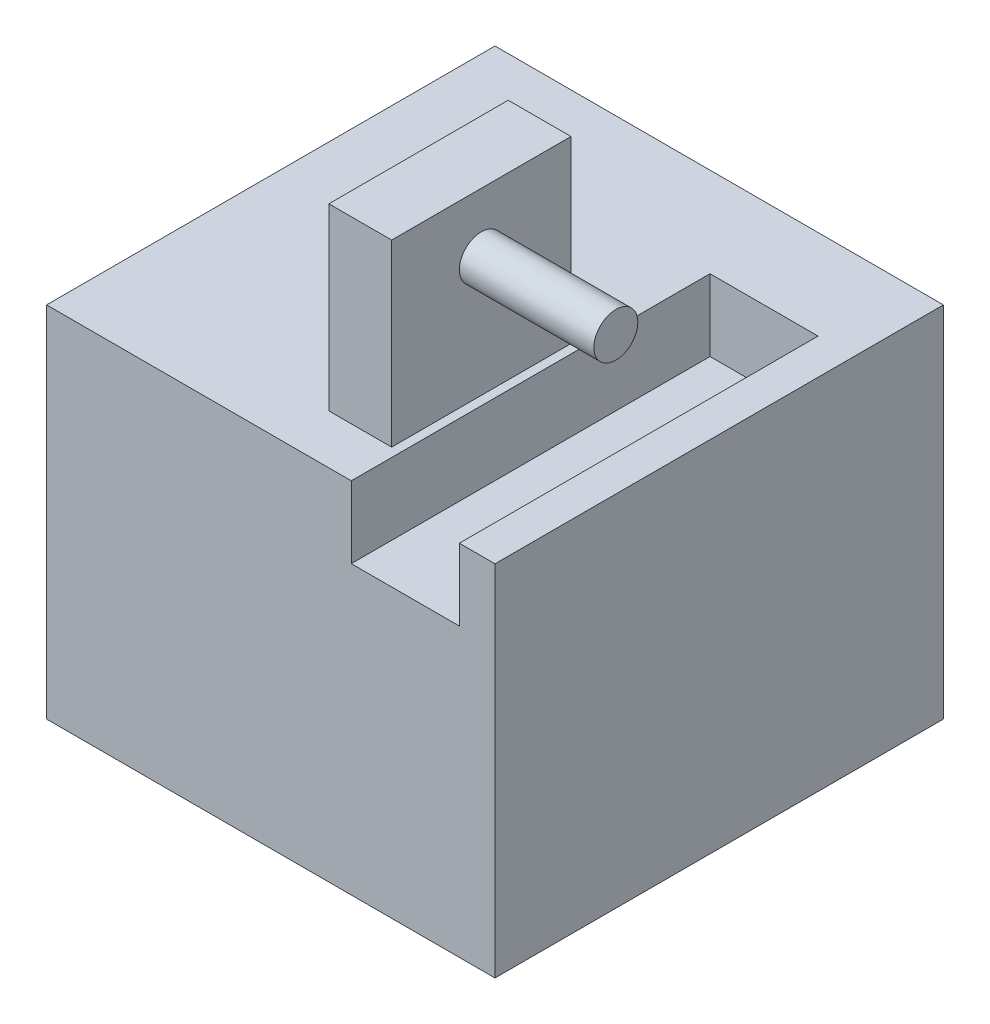
ISO-10303-21;
HEADER;
FILE_DESCRIPTION(('STEP AP214'),'2;1');
FILE_NAME('part.step','',(''),(''),'','','');
FILE_SCHEMA(('AUTOMOTIVE_DESIGN { 1 0 10303 214 1 1 1 1 }'));
ENDSEC;
DATA;
#1=APPLICATION_CONTEXT('core data for automotive mechanical design processes');
#2=APPLICATION_PROTOCOL_DEFINITION('international standard','automotive_design',2000,#1);
#3=PRODUCT_CONTEXT('',#1,'mechanical');
#4=PRODUCT('Part','Part','',(#3));
#5=PRODUCT_RELATED_PRODUCT_CATEGORY('part','',(#4));
#6=PRODUCT_DEFINITION_FORMATION('','',#4);
#7=PRODUCT_DEFINITION_CONTEXT('part definition',#1,'design');
#8=PRODUCT_DEFINITION('design','',#6,#7);
#9=PRODUCT_DEFINITION_SHAPE('','',#8);
#10=(LENGTH_UNIT() NAMED_UNIT(*) SI_UNIT(.MILLI.,.METRE.));
#11=(NAMED_UNIT(*) PLANE_ANGLE_UNIT() SI_UNIT($,.RADIAN.));
#12=(NAMED_UNIT(*) SI_UNIT($,.STERADIAN.) SOLID_ANGLE_UNIT());
#13=UNCERTAINTY_MEASURE_WITH_UNIT(LENGTH_MEASURE(1.E-05),#10,'distance_accuracy_value','');
#14=(GEOMETRIC_REPRESENTATION_CONTEXT(3) GLOBAL_UNCERTAINTY_ASSIGNED_CONTEXT((#13)) GLOBAL_UNIT_ASSIGNED_CONTEXT((#10,
#11,#12)) REPRESENTATION_CONTEXT('',''));
#15=CARTESIAN_POINT('',(0.,0.,0.));
#16=DIRECTION('',(0.,0.,1.));
#17=DIRECTION('',(1.,0.,0.));
#18=AXIS2_PLACEMENT_3D('',#15,#16,#17);
#19=CARTESIAN_POINT('',(-6.025,32.,40.));
#20=DIRECTION('',(-1.,0.,0.));
#21=DIRECTION('',(0.,0.,1.));
#22=AXIS2_PLACEMENT_3D('',#19,#20,#21);
#23=PLANE('',#22);
#24=DIRECTION('',(0.,-1.,0.));
#25=VECTOR('',#24,1.);
#26=CARTESIAN_POINT('',(-6.025,55.6589431316421,0.));
#27=LINE('',#26,#25);
#28=CARTESIAN_POINT('',(-6.025,40.,0.));
#29=VERTEX_POINT('',#28);
#30=CARTESIAN_POINT('',(-6.025,32.,0.));
#31=VERTEX_POINT('',#30);
#32=EDGE_CURVE('E139',#29,#31,#27,.T.);
#33=ORIENTED_EDGE('',*,*,#32,.F.);
#34=DIRECTION('',(0.,0.,1.));
#35=VECTOR('',#34,1.);
#36=CARTESIAN_POINT('',(-6.025,40.,40.));
#37=LINE('',#36,#35);
#38=CARTESIAN_POINT('',(-6.025,40.,40.));
#39=VERTEX_POINT('',#38);
#40=EDGE_CURVE('E153',#29,#39,#37,.T.);
#41=ORIENTED_EDGE('',*,*,#40,.T.);
#42=DIRECTION('',(0.,1.,0.));
#43=VECTOR('',#42,1.);
#44=CARTESIAN_POINT('',(-6.025,32.,40.));
#45=LINE('',#44,#43);
#46=CARTESIAN_POINT('',(-6.025,32.,40.));
#47=VERTEX_POINT('',#46);
#48=EDGE_CURVE('E180',#47,#39,#45,.T.);
#49=ORIENTED_EDGE('',*,*,#48,.F.);
#50=DIRECTION('',(0.,0.,1.));
#51=VECTOR('',#50,1.);
#52=CARTESIAN_POINT('',(-6.025,32.,40.));
#53=LINE('',#52,#51);
#54=EDGE_CURVE('E155',#31,#47,#53,.T.);
#55=ORIENTED_EDGE('',*,*,#54,.F.);
#56=EDGE_LOOP('',(#33,#41,#49,#55));
#57=FACE_BOUND('',#56,.T.);
#58=ADVANCED_FACE('F45',(#57),#23,.F.);
#59=CARTESIAN_POINT('',(6.02500000000002,32.,40.));
#60=DIRECTION('',(1.,0.,0.));
#61=DIRECTION('',(0.,0.,-1.));
#62=AXIS2_PLACEMENT_3D('',#59,#60,#61);
#63=PLANE('',#62);
#64=DIRECTION('',(0.,-1.,0.));
#65=VECTOR('',#64,1.);
#66=CARTESIAN_POINT('',(6.025,55.6589431316421,0.));
#67=LINE('',#66,#65);
#68=CARTESIAN_POINT('',(6.025,40.,0.));
#69=VERTEX_POINT('',#68);
#70=CARTESIAN_POINT('',(6.025,32.,0.));
#71=VERTEX_POINT('',#70);
#72=EDGE_CURVE('E142',#69,#71,#67,.T.);
#73=ORIENTED_EDGE('',*,*,#72,.T.);
#74=DIRECTION('',(0.,0.,-1.));
#75=VECTOR('',#74,1.);
#76=CARTESIAN_POINT('',(6.02500000000002,32.,40.));
#77=LINE('',#76,#75);
#78=CARTESIAN_POINT('',(6.02500000000002,32.,40.));
#79=VERTEX_POINT('',#78);
#80=EDGE_CURVE('E173',#79,#71,#77,.T.);
#81=ORIENTED_EDGE('',*,*,#80,.F.);
#82=DIRECTION('',(0.,1.,0.));
#83=VECTOR('',#82,1.);
#84=CARTESIAN_POINT('',(6.02500000000002,32.,40.));
#85=LINE('',#84,#83);
#86=CARTESIAN_POINT('',(6.02500000000002,40.,40.));
#87=VERTEX_POINT('',#86);
#88=EDGE_CURVE('E176',#79,#87,#85,.T.);
#89=ORIENTED_EDGE('',*,*,#88,.T.);
#90=DIRECTION('',(0.,0.,-1.));
#91=VECTOR('',#90,1.);
#92=CARTESIAN_POINT('',(6.02500000000002,40.,40.));
#93=LINE('',#92,#91);
#94=EDGE_CURVE('E164',#87,#69,#93,.T.);
#95=ORIENTED_EDGE('',*,*,#94,.T.);
#96=EDGE_LOOP('',(#73,#81,#89,#95));
#97=FACE_BOUND('',#96,.T.);
#98=ADVANCED_FACE('F278',(#97),#63,.F.);
#99=CARTESIAN_POINT('',(0.,32.,0.));
#100=DIRECTION('',(0.,-1.,0.));
#101=DIRECTION('',(0.,0.,-1.));
#102=AXIS2_PLACEMENT_3D('',#99,#100,#101);
#103=PLANE('',#102);
#104=DIRECTION('',(1.,0.,0.));
#105=VECTOR('',#104,1.);
#106=CARTESIAN_POINT('',(-6.025,32.,0.));
#107=LINE('',#106,#105);
#108=EDGE_CURVE('E157',#31,#71,#107,.T.);
#109=ORIENTED_EDGE('',*,*,#108,.F.);
#110=ORIENTED_EDGE('',*,*,#54,.T.);
#111=DIRECTION('',(1.,0.,0.));
#112=VECTOR('',#111,1.);
#113=CARTESIAN_POINT('',(-6.025,32.,40.));
#114=LINE('',#113,#112);
#115=EDGE_CURVE('E268',#47,#79,#114,.T.);
#116=ORIENTED_EDGE('',*,*,#115,.T.);
#117=ORIENTED_EDGE('',*,*,#80,.T.);
#118=EDGE_LOOP('',(#109,#110,#116,#117));
#119=FACE_BOUND('',#118,.T.);
#120=ADVANCED_FACE('F276',(#119),#103,.F.);
#121=CARTESIAN_POINT('',(0.,0.,0.));
#122=DIRECTION('',(0.,1.,0.));
#123=DIRECTION('',(0.,0.,1.));
#124=AXIS2_PLACEMENT_3D('',#121,#122,#123);
#125=PLANE('',#124);
#126=DIRECTION('',(0.,0.,-1.));
#127=VECTOR('',#126,1.);
#128=CARTESIAN_POINT('',(10.,0.,40.));
#129=LINE('',#128,#127);
#130=CARTESIAN_POINT('',(10.,0.,40.));
#131=VERTEX_POINT('',#130);
#132=CARTESIAN_POINT('',(10.,0.,-10.));
#133=VERTEX_POINT('',#132);
#134=EDGE_CURVE('E61',#131,#133,#129,.T.);
#135=ORIENTED_EDGE('',*,*,#134,.F.);
#136=DIRECTION('',(1.,0.,0.));
#137=VECTOR('',#136,1.);
#138=CARTESIAN_POINT('',(-40.,0.,40.));
#139=LINE('',#138,#137);
#140=CARTESIAN_POINT('',(-40.,0.,40.));
#141=VERTEX_POINT('',#140);
#142=EDGE_CURVE('E187',#141,#131,#139,.T.);
#143=ORIENTED_EDGE('',*,*,#142,.F.);
#144=DIRECTION('',(0.,0.,1.));
#145=VECTOR('',#144,1.);
#146=CARTESIAN_POINT('',(-40.,0.,-40.));
#147=LINE('',#146,#145);
#148=CARTESIAN_POINT('',(-40.,0.,-10.));
#149=VERTEX_POINT('',#148);
#150=EDGE_CURVE('E179',#149,#141,#147,.T.);
#151=ORIENTED_EDGE('',*,*,#150,.F.);
#152=DIRECTION('',(-1.,0.,0.));
#153=VECTOR('',#152,1.);
#154=CARTESIAN_POINT('',(40.,0.,-10.));
#155=LINE('',#154,#153);
#156=EDGE_CURVE('E207',#133,#149,#155,.T.);
#157=ORIENTED_EDGE('',*,*,#156,.F.);
#158=EDGE_LOOP('',(#135,#143,#151,#157));
#159=FACE_BOUND('',#158,.T.);
#160=ADVANCED_FACE('F205',(#159),#125,.F.);
#161=CARTESIAN_POINT('',(-40.,40.,40.));
#162=DIRECTION('',(0.,0.,-1.));
#163=DIRECTION('',(-1.,0.,0.));
#164=AXIS2_PLACEMENT_3D('',#161,#162,#163);
#165=PLANE('',#164);
#166=DIRECTION('',(0.,-1.,0.));
#167=VECTOR('',#166,1.);
#168=CARTESIAN_POINT('',(10.,40.,40.));
#169=LINE('',#168,#167);
#170=CARTESIAN_POINT('',(10.,40.,40.));
#171=VERTEX_POINT('',#170);
#172=EDGE_CURVE('E148',#171,#131,#169,.T.);
#173=ORIENTED_EDGE('',*,*,#172,.F.);
#174=DIRECTION('',(1.,0.,0.));
#175=VECTOR('',#174,1.);
#176=CARTESIAN_POINT('',(-40.,40.,40.));
#177=LINE('',#176,#175);
#178=EDGE_CURVE('E186',#87,#171,#177,.T.);
#179=ORIENTED_EDGE('',*,*,#178,.F.);
#180=ORIENTED_EDGE('',*,*,#88,.F.);
#181=ORIENTED_EDGE('',*,*,#115,.F.);
#182=ORIENTED_EDGE('',*,*,#48,.T.);
#183=CARTESIAN_POINT('',(-40.,40.,40.));
#184=VERTEX_POINT('',#183);
#185=EDGE_CURVE('E162',#184,#39,#177,.T.);
#186=ORIENTED_EDGE('',*,*,#185,.F.);
#187=DIRECTION('',(0.,-1.,0.));
#188=VECTOR('',#187,1.);
#189=CARTESIAN_POINT('',(-40.,40.,40.));
#190=LINE('',#189,#188);
#191=EDGE_CURVE('E54',#184,#141,#190,.T.);
#192=ORIENTED_EDGE('',*,*,#191,.T.);
#193=ORIENTED_EDGE('',*,*,#142,.T.);
#194=EDGE_LOOP('',(#173,#179,#180,#181,#182,#186,#192,#193));
#195=FACE_BOUND('',#194,.T.);
#196=ADVANCED_FACE('F200',(#195),#165,.F.);
#197=CARTESIAN_POINT('',(0.,0.,-10.));
#198=DIRECTION('',(0.,0.,-1.));
#199=DIRECTION('',(-1.,0.,0.));
#200=AXIS2_PLACEMENT_3D('',#197,#198,#199);
#201=PLANE('',#200);
#202=DIRECTION('',(1.,0.,0.));
#203=VECTOR('',#202,1.);
#204=CARTESIAN_POINT('',(40.,40.,-10.));
#205=LINE('',#204,#203);
#206=CARTESIAN_POINT('',(-40.,40.,-10.));
#207=VERTEX_POINT('',#206);
#208=CARTESIAN_POINT('',(10.,40.,-10.));
#209=VERTEX_POINT('',#208);
#210=EDGE_CURVE('E225',#207,#209,#205,.T.);
#211=ORIENTED_EDGE('',*,*,#210,.T.);
#212=DIRECTION('',(0.,1.,0.));
#213=VECTOR('',#212,1.);
#214=CARTESIAN_POINT('',(10.,40.,-10.));
#215=LINE('',#214,#213);
#216=EDGE_CURVE('E209',#133,#209,#215,.T.);
#217=ORIENTED_EDGE('',*,*,#216,.F.);
#218=ORIENTED_EDGE('',*,*,#156,.T.);
#219=DIRECTION('',(0.,1.,0.));
#220=VECTOR('',#219,1.);
#221=CARTESIAN_POINT('',(-40.,40.,-10.));
#222=LINE('',#221,#220);
#223=EDGE_CURVE('E222',#149,#207,#222,.T.);
#224=ORIENTED_EDGE('',*,*,#223,.T.);
#225=EDGE_LOOP('',(#211,#217,#218,#224));
#226=FACE_BOUND('',#225,.T.);
#227=ADVANCED_FACE('F290',(#226),#201,.T.);
#228=CARTESIAN_POINT('',(0.,40.,0.));
#229=DIRECTION('',(0.,1.,0.));
#230=DIRECTION('',(0.,0.,1.));
#231=AXIS2_PLACEMENT_3D('',#228,#229,#230);
#232=PLANE('',#231);
#233=DIRECTION('',(-1.,0.,0.));
#234=VECTOR('',#233,1.);
#235=CARTESIAN_POINT('',(-7.025,40.,14.5));
#236=LINE('',#235,#234);
#237=CARTESIAN_POINT('',(-7.025,40.,14.5));
#238=VERTEX_POINT('',#237);
#239=CARTESIAN_POINT('',(-14.025,40.,14.5));
#240=VERTEX_POINT('',#239);
#241=EDGE_CURVE('E251',#238,#240,#236,.T.);
#242=ORIENTED_EDGE('',*,*,#241,.F.);
#243=DIRECTION('',(0.,0.,-1.));
#244=VECTOR('',#243,1.);
#245=CARTESIAN_POINT('',(-7.025,40.,14.5));
#246=LINE('',#245,#244);
#247=CARTESIAN_POINT('',(-7.025,40.,34.5));
#248=VERTEX_POINT('',#247);
#249=EDGE_CURVE('E232',#248,#238,#246,.T.);
#250=ORIENTED_EDGE('',*,*,#249,.F.);
#251=DIRECTION('',(1.,0.,0.));
#252=VECTOR('',#251,1.);
#253=CARTESIAN_POINT('',(-7.025,40.,34.5));
#254=LINE('',#253,#252);
#255=CARTESIAN_POINT('',(-14.025,40.,34.5));
#256=VERTEX_POINT('',#255);
#257=EDGE_CURVE('E238',#256,#248,#254,.T.);
#258=ORIENTED_EDGE('',*,*,#257,.F.);
#259=DIRECTION('',(0.,0.,1.));
#260=VECTOR('',#259,1.);
#261=CARTESIAN_POINT('',(-14.025,40.,14.5));
#262=LINE('',#261,#260);
#263=EDGE_CURVE('E254',#240,#256,#262,.T.);
#264=ORIENTED_EDGE('',*,*,#263,.F.);
#265=EDGE_LOOP('',(#242,#250,#258,#264));
#266=FACE_BOUND('',#265,.T.);
#267=ORIENTED_EDGE('',*,*,#40,.F.);
#268=DIRECTION('',(1.,0.,0.));
#269=VECTOR('',#268,1.);
#270=CARTESIAN_POINT('',(-6.025,40.,0.));
#271=LINE('',#270,#269);
#272=EDGE_CURVE('E136',#29,#69,#271,.T.);
#273=ORIENTED_EDGE('',*,*,#272,.T.);
#274=ORIENTED_EDGE('',*,*,#94,.F.);
#275=ORIENTED_EDGE('',*,*,#178,.T.);
#276=DIRECTION('',(0.,0.,1.));
#277=VECTOR('',#276,1.);
#278=CARTESIAN_POINT('',(10.,40.,40.));
#279=LINE('',#278,#277);
#280=EDGE_CURVE('E213',#209,#171,#279,.T.);
#281=ORIENTED_EDGE('',*,*,#280,.F.);
#282=ORIENTED_EDGE('',*,*,#210,.F.);
#283=DIRECTION('',(0.,0.,1.));
#284=VECTOR('',#283,1.);
#285=CARTESIAN_POINT('',(-40.,40.,-40.));
#286=LINE('',#285,#284);
#287=EDGE_CURVE('E183',#207,#184,#286,.T.);
#288=ORIENTED_EDGE('',*,*,#287,.T.);
#289=ORIENTED_EDGE('',*,*,#185,.T.);
#290=EDGE_LOOP('',(#267,#273,#274,#275,#281,#282,#288,#289));
#291=FACE_BOUND('',#290,.T.);
#292=ADVANCED_FACE('F160',(#266,#291),#232,.T.);
#293=CARTESIAN_POINT('',(-40.,40.,-40.));
#294=DIRECTION('',(1.,0.,0.));
#295=DIRECTION('',(0.,0.,-1.));
#296=AXIS2_PLACEMENT_3D('',#293,#294,#295);
#297=PLANE('',#296);
#298=ORIENTED_EDGE('',*,*,#223,.F.);
#299=ORIENTED_EDGE('',*,*,#150,.T.);
#300=ORIENTED_EDGE('',*,*,#191,.F.);
#301=ORIENTED_EDGE('',*,*,#287,.F.);
#302=EDGE_LOOP('',(#298,#299,#300,#301));
#303=FACE_BOUND('',#302,.T.);
#304=ADVANCED_FACE('F47',(#303),#297,.F.);
#305=CARTESIAN_POINT('',(-7.025,60.,14.5));
#306=DIRECTION('',(-1.,0.,0.));
#307=DIRECTION('',(0.,0.,1.));
#308=AXIS2_PLACEMENT_3D('',#305,#306,#307);
#309=PLANE('',#308);
#310=CARTESIAN_POINT('',(-7.025,53.35,24.5));
#311=DIRECTION('',(-1.,0.,0.));
#312=DIRECTION('',(0.,0.,1.));
#313=AXIS2_PLACEMENT_3D('',#310,#311,#312);
#314=CIRCLE('',#313,2.45);
#315=CARTESIAN_POINT('',(-7.025,53.35,26.95));
#316=VERTEX_POINT('',#315);
#317=EDGE_CURVE('E11',#316,#316,#314,.F.);
#318=ORIENTED_EDGE('',*,*,#317,.F.);
#319=EDGE_LOOP('',(#318));
#320=FACE_BOUND('',#319,.T.);
#321=ORIENTED_EDGE('',*,*,#249,.T.);
#322=DIRECTION('',(0.,-1.,0.));
#323=VECTOR('',#322,1.);
#324=CARTESIAN_POINT('',(-7.025,60.,14.5));
#325=LINE('',#324,#323);
#326=CARTESIAN_POINT('',(-7.025,60.,14.5));
#327=VERTEX_POINT('',#326);
#328=EDGE_CURVE('E165',#327,#238,#325,.T.);
#329=ORIENTED_EDGE('',*,*,#328,.F.);
#330=DIRECTION('',(0.,0.,-1.));
#331=VECTOR('',#330,1.);
#332=CARTESIAN_POINT('',(-7.025,60.,14.5));
#333=LINE('',#332,#331);
#334=CARTESIAN_POINT('',(-7.025,60.,34.5));
#335=VERTEX_POINT('',#334);
#336=EDGE_CURVE('E233',#335,#327,#333,.T.);
#337=ORIENTED_EDGE('',*,*,#336,.F.);
#338=DIRECTION('',(0.,-1.,0.));
#339=VECTOR('',#338,1.);
#340=CARTESIAN_POINT('',(-7.025,60.,34.5));
#341=LINE('',#340,#339);
#342=EDGE_CURVE('E247',#335,#248,#341,.T.);
#343=ORIENTED_EDGE('',*,*,#342,.T.);
#344=EDGE_LOOP('',(#321,#329,#337,#343));
#345=FACE_BOUND('',#344,.T.);
#346=ADVANCED_FACE('F318',(#320,#345),#309,.F.);
#347=CARTESIAN_POINT('',(-7.025,60.,14.5));
#348=DIRECTION('',(0.,0.,1.));
#349=DIRECTION('',(1.,0.,0.));
#350=AXIS2_PLACEMENT_3D('',#347,#348,#349);
#351=PLANE('',#350);
#352=ORIENTED_EDGE('',*,*,#241,.T.);
#353=DIRECTION('',(0.,-1.,0.));
#354=VECTOR('',#353,1.);
#355=CARTESIAN_POINT('',(-14.025,60.,14.5));
#356=LINE('',#355,#354);
#357=CARTESIAN_POINT('',(-14.025,60.,14.5));
#358=VERTEX_POINT('',#357);
#359=EDGE_CURVE('E170',#358,#240,#356,.T.);
#360=ORIENTED_EDGE('',*,*,#359,.F.);
#361=DIRECTION('',(-1.,0.,0.));
#362=VECTOR('',#361,1.);
#363=CARTESIAN_POINT('',(-7.025,60.,14.5));
#364=LINE('',#363,#362);
#365=EDGE_CURVE('E237',#327,#358,#364,.T.);
#366=ORIENTED_EDGE('',*,*,#365,.F.);
#367=ORIENTED_EDGE('',*,*,#328,.T.);
#368=EDGE_LOOP('',(#352,#360,#366,#367));
#369=FACE_BOUND('',#368,.T.);
#370=ADVANCED_FACE('F321',(#369),#351,.F.);
#371=CARTESIAN_POINT('',(-14.025,60.,14.5));
#372=DIRECTION('',(1.,0.,0.));
#373=DIRECTION('',(0.,0.,-1.));
#374=AXIS2_PLACEMENT_3D('',#371,#372,#373);
#375=PLANE('',#374);
#376=ORIENTED_EDGE('',*,*,#263,.T.);
#377=DIRECTION('',(0.,-1.,0.));
#378=VECTOR('',#377,1.);
#379=CARTESIAN_POINT('',(-14.025,60.,34.5));
#380=LINE('',#379,#378);
#381=CARTESIAN_POINT('',(-14.025,60.,34.5));
#382=VERTEX_POINT('',#381);
#383=EDGE_CURVE('E69',#382,#256,#380,.T.);
#384=ORIENTED_EDGE('',*,*,#383,.F.);
#385=DIRECTION('',(0.,0.,1.));
#386=VECTOR('',#385,1.);
#387=CARTESIAN_POINT('',(-14.025,60.,14.5));
#388=LINE('',#387,#386);
#389=EDGE_CURVE('E241',#358,#382,#388,.T.);
#390=ORIENTED_EDGE('',*,*,#389,.F.);
#391=ORIENTED_EDGE('',*,*,#359,.T.);
#392=EDGE_LOOP('',(#376,#384,#390,#391));
#393=FACE_BOUND('',#392,.T.);
#394=ADVANCED_FACE('F325',(#393),#375,.F.);
#395=CARTESIAN_POINT('',(-7.025,60.,34.5));
#396=DIRECTION('',(0.,0.,-1.));
#397=DIRECTION('',(-1.,0.,0.));
#398=AXIS2_PLACEMENT_3D('',#395,#396,#397);
#399=PLANE('',#398);
#400=ORIENTED_EDGE('',*,*,#257,.T.);
#401=ORIENTED_EDGE('',*,*,#342,.F.);
#402=DIRECTION('',(1.,0.,0.));
#403=VECTOR('',#402,1.);
#404=CARTESIAN_POINT('',(-7.025,60.,34.5));
#405=LINE('',#404,#403);
#406=EDGE_CURVE('E244',#382,#335,#405,.T.);
#407=ORIENTED_EDGE('',*,*,#406,.F.);
#408=ORIENTED_EDGE('',*,*,#383,.T.);
#409=EDGE_LOOP('',(#400,#401,#407,#408));
#410=FACE_BOUND('',#409,.T.);
#411=ADVANCED_FACE('F329',(#410),#399,.F.);
#412=CARTESIAN_POINT('',(0.,60.,0.));
#413=DIRECTION('',(0.,-1.,0.));
#414=DIRECTION('',(0.,0.,-1.));
#415=AXIS2_PLACEMENT_3D('',#412,#413,#414);
#416=PLANE('',#415);
#417=ORIENTED_EDGE('',*,*,#336,.T.);
#418=ORIENTED_EDGE('',*,*,#365,.T.);
#419=ORIENTED_EDGE('',*,*,#389,.T.);
#420=ORIENTED_EDGE('',*,*,#406,.T.);
#421=EDGE_LOOP('',(#417,#418,#419,#420));
#422=FACE_BOUND('',#421,.T.);
#423=ADVANCED_FACE('F333',(#422),#416,.F.);
#424=CARTESIAN_POINT('',(7.975,53.35,24.5));
#425=DIRECTION('',(-1.,0.,0.));
#426=DIRECTION('',(0.,0.,1.));
#427=AXIS2_PLACEMENT_3D('',#424,#425,#426);
#428=CYLINDRICAL_SURFACE('',#427,2.45);
#429=CARTESIAN_POINT('',(7.975,53.35,24.5));
#430=DIRECTION('',(1.,0.,0.));
#431=DIRECTION('',(0.,0.,-1.));
#432=AXIS2_PLACEMENT_3D('',#429,#430,#431);
#433=CIRCLE('',#432,2.45);
#434=CARTESIAN_POINT('',(7.975,53.35,22.05));
#435=VERTEX_POINT('',#434);
#436=EDGE_CURVE('E228',#435,#435,#433,.T.);
#437=ORIENTED_EDGE('',*,*,#436,.F.);
#438=EDGE_LOOP('',(#437));
#439=FACE_BOUND('',#438,.T.);
#440=ORIENTED_EDGE('',*,*,#317,.T.);
#441=EDGE_LOOP('',(#440));
#442=FACE_BOUND('',#441,.T.);
#443=ADVANCED_FACE('F336',(#439,#442),#428,.T.);
#444=CARTESIAN_POINT('',(7.975,53.35,24.5));
#445=DIRECTION('',(1.,0.,0.));
#446=DIRECTION('',(0.,0.,-1.));
#447=AXIS2_PLACEMENT_3D('',#444,#445,#446);
#448=PLANE('',#447);
#449=ORIENTED_EDGE('',*,*,#436,.T.);
#450=EDGE_LOOP('',(#449));
#451=FACE_BOUND('',#450,.T.);
#452=ADVANCED_FACE('F339',(#451),#448,.T.);
#453=CARTESIAN_POINT('',(10.,0.,0.));
#454=DIRECTION('',(1.,0.,0.));
#455=DIRECTION('',(0.,0.,-1.));
#456=AXIS2_PLACEMENT_3D('',#453,#454,#455);
#457=PLANE('',#456);
#458=ORIENTED_EDGE('',*,*,#172,.T.);
#459=ORIENTED_EDGE('',*,*,#134,.T.);
#460=ORIENTED_EDGE('',*,*,#216,.T.);
#461=ORIENTED_EDGE('',*,*,#280,.T.);
#462=EDGE_LOOP('',(#458,#459,#460,#461));
#463=FACE_BOUND('',#462,.T.);
#464=ADVANCED_FACE('F286',(#463),#457,.T.);
#465=CARTESIAN_POINT('',(-6.025,55.6589431316421,0.));
#466=DIRECTION('',(0.,0.,-1.));
#467=DIRECTION('',(-1.,0.,0.));
#468=AXIS2_PLACEMENT_3D('',#465,#466,#467);
#469=PLANE('',#468);
#470=ORIENTED_EDGE('',*,*,#272,.F.);
#471=ORIENTED_EDGE('',*,*,#32,.T.);
#472=ORIENTED_EDGE('',*,*,#108,.T.);
#473=ORIENTED_EDGE('',*,*,#72,.F.);
#474=EDGE_LOOP('',(#470,#471,#472,#473));
#475=FACE_BOUND('',#474,.T.);
#476=ADVANCED_FACE('F138',(#475),#469,.F.);
#477=CLOSED_SHELL('',(#58,#98,#120,#160,#196,#227,#292,#304,#346,#370,#394,#411,#423,#443,#452,
#464,#476));
#478=MANIFOLD_SOLID_BREP('B2',#477);
#479=ADVANCED_BREP_SHAPE_REPRESENTATION('',(#18,#478),#14);
#480=SHAPE_DEFINITION_REPRESENTATION(#9,#479);
ENDSEC;
END-ISO-10303-21;
